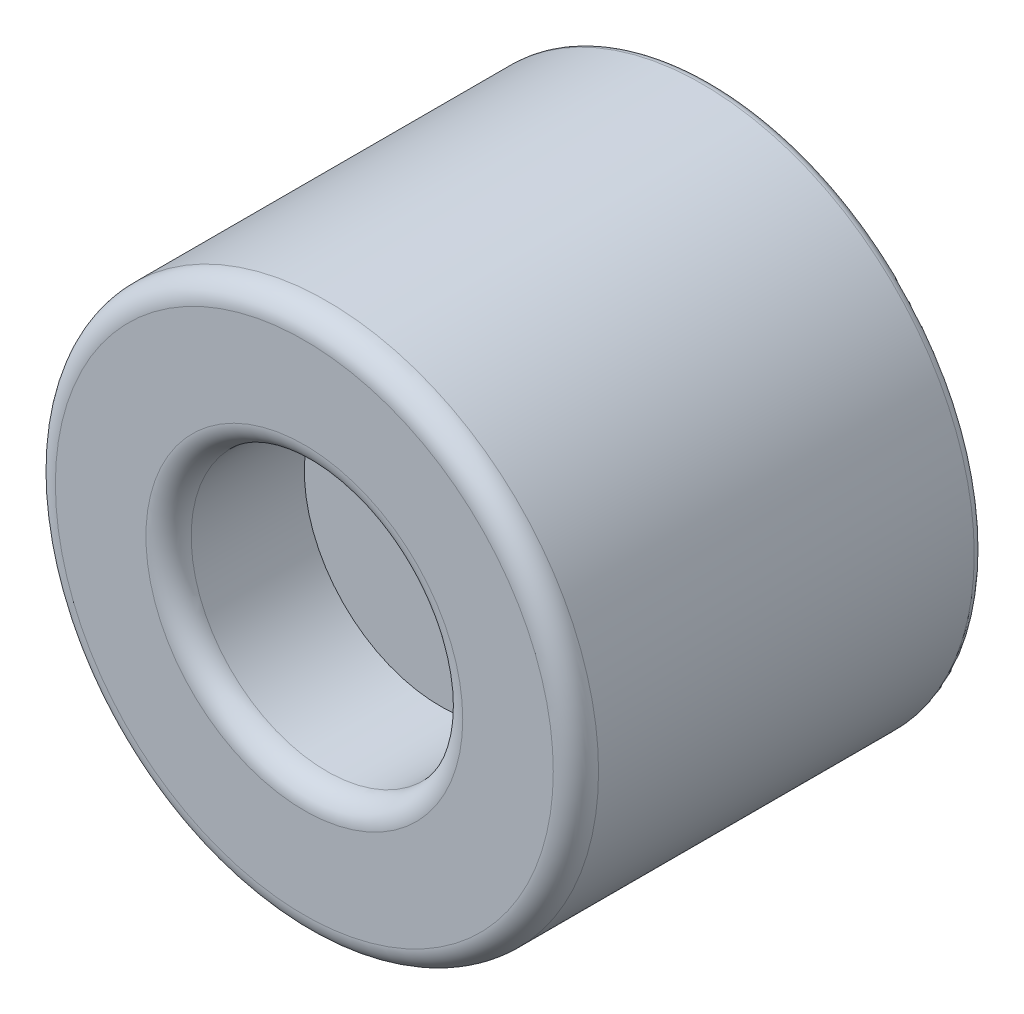
ISO-10303-21;
HEADER;
FILE_DESCRIPTION(('STEP AP214'),'2;1');
FILE_NAME('part.step','',(''),(''),'','','');
FILE_SCHEMA(('AUTOMOTIVE_DESIGN { 1 0 10303 214 1 1 1 1 }'));
ENDSEC;
DATA;
#1=APPLICATION_CONTEXT('core data for automotive mechanical design processes');
#2=APPLICATION_PROTOCOL_DEFINITION('international standard','automotive_design',2000,#1);
#3=PRODUCT_CONTEXT('',#1,'mechanical');
#4=PRODUCT('Part','Part','',(#3));
#5=PRODUCT_RELATED_PRODUCT_CATEGORY('part','',(#4));
#6=PRODUCT_DEFINITION_FORMATION('','',#4);
#7=PRODUCT_DEFINITION_CONTEXT('part definition',#1,'design');
#8=PRODUCT_DEFINITION('design','',#6,#7);
#9=PRODUCT_DEFINITION_SHAPE('','',#8);
#10=(LENGTH_UNIT() NAMED_UNIT(*) SI_UNIT(.MILLI.,.METRE.));
#11=(NAMED_UNIT(*) PLANE_ANGLE_UNIT() SI_UNIT($,.RADIAN.));
#12=(NAMED_UNIT(*) SI_UNIT($,.STERADIAN.) SOLID_ANGLE_UNIT());
#13=UNCERTAINTY_MEASURE_WITH_UNIT(LENGTH_MEASURE(1.E-05),#10,'distance_accuracy_value','');
#14=(GEOMETRIC_REPRESENTATION_CONTEXT(3) GLOBAL_UNCERTAINTY_ASSIGNED_CONTEXT((#13)) GLOBAL_UNIT_ASSIGNED_CONTEXT((#10,
#11,#12)) REPRESENTATION_CONTEXT('',''));
#15=CARTESIAN_POINT('',(0.,0.,0.));
#16=DIRECTION('',(0.,0.,1.));
#17=DIRECTION('',(1.,0.,0.));
#18=AXIS2_PLACEMENT_3D('',#15,#16,#17);
#19=CARTESIAN_POINT('',(0.,0.,0.));
#20=DIRECTION('',(0.,0.,1.));
#21=DIRECTION('',(1.,0.,0.));
#22=AXIS2_PLACEMENT_3D('',#19,#20,#21);
#23=PLANE('',#22);
#24=CARTESIAN_POINT('',(0.,0.,0.));
#25=DIRECTION('',(0.,0.,1.));
#26=DIRECTION('',(1.,0.,0.));
#27=AXIS2_PLACEMENT_3D('',#24,#25,#26);
#28=CIRCLE('',#27,5.8);
#29=CARTESIAN_POINT('',(5.8,0.,0.));
#30=VERTEX_POINT('',#29);
#31=EDGE_CURVE('E44',#30,#30,#28,.F.);
#32=ORIENTED_EDGE('',*,*,#31,.T.);
#33=EDGE_LOOP('',(#32));
#34=FACE_BOUND('',#33,.T.);
#35=CARTESIAN_POINT('',(0.,0.,0.));
#36=DIRECTION('',(0.,0.,1.));
#37=DIRECTION('',(1.,0.,0.));
#38=AXIS2_PLACEMENT_3D('',#35,#36,#37);
#39=CIRCLE('',#38,4.7);
#40=CARTESIAN_POINT('',(4.7,0.,0.));
#41=VERTEX_POINT('',#40);
#42=EDGE_CURVE('E48',#41,#41,#39,.T.);
#43=ORIENTED_EDGE('',*,*,#42,.T.);
#44=EDGE_LOOP('',(#43));
#45=FACE_BOUND('',#44,.T.);
#46=ADVANCED_FACE('F37',(#34,#45),#23,.F.);
#47=CARTESIAN_POINT('',(0.,0.,3.));
#48=DIRECTION('',(0.,0.,-1.));
#49=DIRECTION('',(-1.,0.,0.));
#50=AXIS2_PLACEMENT_3D('',#47,#48,#49);
#51=CYLINDRICAL_SURFACE('',#50,6.);
#52=CARTESIAN_POINT('',(0.,0.,0.2));
#53=DIRECTION('',(0.,0.,1.));
#54=DIRECTION('',(1.,0.,0.));
#55=AXIS2_PLACEMENT_3D('',#52,#53,#54);
#56=CIRCLE('',#55,6.);
#57=CARTESIAN_POINT('',(6.,0.,0.2));
#58=VERTEX_POINT('',#57);
#59=EDGE_CURVE('E52',#58,#58,#56,.T.);
#60=ORIENTED_EDGE('',*,*,#59,.T.);
#61=EDGE_LOOP('',(#60));
#62=FACE_BOUND('',#61,.T.);
#63=CARTESIAN_POINT('',(0.,0.,8.5));
#64=DIRECTION('',(0.,0.,1.));
#65=DIRECTION('',(1.,0.,0.));
#66=AXIS2_PLACEMENT_3D('',#63,#64,#65);
#67=CIRCLE('',#66,6.);
#68=CARTESIAN_POINT('',(6.,0.,8.5));
#69=VERTEX_POINT('',#68);
#70=EDGE_CURVE('E57',#69,#69,#67,.F.);
#71=ORIENTED_EDGE('',*,*,#70,.T.);
#72=EDGE_LOOP('',(#71));
#73=FACE_BOUND('',#72,.T.);
#74=ADVANCED_FACE('F93',(#62,#73),#51,.T.);
#75=CARTESIAN_POINT('',(0.,0.,3.));
#76=DIRECTION('',(0.,0.,-1.));
#77=DIRECTION('',(-1.,0.,0.));
#78=AXIS2_PLACEMENT_3D('',#75,#76,#77);
#79=CYLINDRICAL_SURFACE('',#78,4.5);
#80=CARTESIAN_POINT('',(0.,0.,0.2));
#81=DIRECTION('',(0.,0.,1.));
#82=DIRECTION('',(1.,0.,0.));
#83=AXIS2_PLACEMENT_3D('',#80,#81,#82);
#84=CIRCLE('',#83,4.5);
#85=CARTESIAN_POINT('',(4.5,0.,0.2));
#86=VERTEX_POINT('',#85);
#87=EDGE_CURVE('E10',#86,#86,#84,.F.);
#88=ORIENTED_EDGE('',*,*,#87,.T.);
#89=EDGE_LOOP('',(#88));
#90=FACE_BOUND('',#89,.T.);
#91=CARTESIAN_POINT('',(0.,0.,3.));
#92=DIRECTION('',(0.,0.,1.));
#93=DIRECTION('',(1.,0.,0.));
#94=AXIS2_PLACEMENT_3D('',#91,#92,#93);
#95=CIRCLE('',#94,4.5);
#96=CARTESIAN_POINT('',(4.5,0.,3.));
#97=VERTEX_POINT('',#96);
#98=EDGE_CURVE('E69',#97,#97,#95,.T.);
#99=ORIENTED_EDGE('',*,*,#98,.T.);
#100=EDGE_LOOP('',(#99));
#101=FACE_BOUND('',#100,.T.);
#102=ADVANCED_FACE('F98',(#90,#101),#79,.F.);
#103=CARTESIAN_POINT('',(0.,0.,3.));
#104=DIRECTION('',(0.,0.,1.));
#105=DIRECTION('',(1.,0.,0.));
#106=AXIS2_PLACEMENT_3D('',#103,#104,#105);
#107=PLANE('',#106);
#108=ORIENTED_EDGE('',*,*,#98,.F.);
#109=EDGE_LOOP('',(#108));
#110=FACE_BOUND('',#109,.T.);
#111=ADVANCED_FACE('F89',(#110),#107,.F.);
#112=CARTESIAN_POINT('',(0.,0.,9.));
#113=DIRECTION('',(0.,0.,1.));
#114=DIRECTION('',(1.,0.,0.));
#115=AXIS2_PLACEMENT_3D('',#112,#113,#114);
#116=PLANE('',#115);
#117=CARTESIAN_POINT('',(0.,0.,9.));
#118=DIRECTION('',(0.,0.,1.));
#119=DIRECTION('',(1.,0.,0.));
#120=AXIS2_PLACEMENT_3D('',#117,#118,#119);
#121=CIRCLE('',#120,5.5);
#122=CARTESIAN_POINT('',(5.5,0.,9.));
#123=VERTEX_POINT('',#122);
#124=EDGE_CURVE('E60',#123,#123,#121,.T.);
#125=ORIENTED_EDGE('',*,*,#124,.T.);
#126=EDGE_LOOP('',(#125));
#127=FACE_BOUND('',#126,.T.);
#128=CARTESIAN_POINT('',(0.,0.,9.));
#129=DIRECTION('',(0.,0.,1.));
#130=DIRECTION('',(1.,0.,0.));
#131=AXIS2_PLACEMENT_3D('',#128,#129,#130);
#132=CIRCLE('',#131,3.5);
#133=CARTESIAN_POINT('',(3.5,0.,9.));
#134=VERTEX_POINT('',#133);
#135=EDGE_CURVE('E63',#134,#134,#132,.F.);
#136=ORIENTED_EDGE('',*,*,#135,.T.);
#137=EDGE_LOOP('',(#136));
#138=FACE_BOUND('',#137,.T.);
#139=ADVANCED_FACE('F80',(#127,#138),#116,.T.);
#140=CARTESIAN_POINT('',(0.,0.,6.));
#141=DIRECTION('',(0.,0.,1.));
#142=DIRECTION('',(1.,0.,0.));
#143=AXIS2_PLACEMENT_3D('',#140,#141,#142);
#144=CYLINDRICAL_SURFACE('',#143,3.);
#145=CARTESIAN_POINT('',(0.,0.,8.5));
#146=DIRECTION('',(0.,0.,1.));
#147=DIRECTION('',(1.,0.,0.));
#148=AXIS2_PLACEMENT_3D('',#145,#146,#147);
#149=CIRCLE('',#148,3.);
#150=CARTESIAN_POINT('',(3.,0.,8.5));
#151=VERTEX_POINT('',#150);
#152=EDGE_CURVE('E66',#151,#151,#149,.T.);
#153=ORIENTED_EDGE('',*,*,#152,.T.);
#154=EDGE_LOOP('',(#153));
#155=FACE_BOUND('',#154,.T.);
#156=CARTESIAN_POINT('',(0.,0.,6.));
#157=DIRECTION('',(0.,0.,1.));
#158=DIRECTION('',(1.,0.,0.));
#159=AXIS2_PLACEMENT_3D('',#156,#157,#158);
#160=CIRCLE('',#159,3.);
#161=CARTESIAN_POINT('',(3.,0.,6.));
#162=VERTEX_POINT('',#161);
#163=EDGE_CURVE('E72',#162,#162,#160,.T.);
#164=ORIENTED_EDGE('',*,*,#163,.F.);
#165=EDGE_LOOP('',(#164));
#166=FACE_BOUND('',#165,.T.);
#167=ADVANCED_FACE('F78',(#155,#166),#144,.F.);
#168=CARTESIAN_POINT('',(0.,0.,6.));
#169=DIRECTION('',(0.,0.,1.));
#170=DIRECTION('',(1.,0.,0.));
#171=AXIS2_PLACEMENT_3D('',#168,#169,#170);
#172=PLANE('',#171);
#173=ORIENTED_EDGE('',*,*,#163,.T.);
#174=EDGE_LOOP('',(#173));
#175=FACE_BOUND('',#174,.T.);
#176=ADVANCED_FACE('F76',(#175),#172,.T.);
#177=CARTESIAN_POINT('',(0.,0.,8.5));
#178=DIRECTION('',(0.,0.,1.));
#179=DIRECTION('',(1.,0.,0.));
#180=AXIS2_PLACEMENT_3D('',#177,#178,#179);
#181=TOROIDAL_SURFACE('',#180,3.5,0.5);
#182=ORIENTED_EDGE('',*,*,#135,.F.);
#183=EDGE_LOOP('',(#182));
#184=FACE_BOUND('',#183,.T.);
#185=ORIENTED_EDGE('',*,*,#152,.F.);
#186=EDGE_LOOP('',(#185));
#187=FACE_BOUND('',#186,.T.);
#188=ADVANCED_FACE('F87',(#184,#187),#181,.T.);
#189=CARTESIAN_POINT('',(0.,0.,8.5));
#190=DIRECTION('',(0.,0.,1.));
#191=DIRECTION('',(1.,0.,0.));
#192=AXIS2_PLACEMENT_3D('',#189,#190,#191);
#193=TOROIDAL_SURFACE('',#192,5.5,0.5);
#194=ORIENTED_EDGE('',*,*,#70,.F.);
#195=EDGE_LOOP('',(#194));
#196=FACE_BOUND('',#195,.T.);
#197=ORIENTED_EDGE('',*,*,#124,.F.);
#198=EDGE_LOOP('',(#197));
#199=FACE_BOUND('',#198,.T.);
#200=ADVANCED_FACE('F107',(#196,#199),#193,.T.);
#201=CARTESIAN_POINT('',(0.,0.,0.2));
#202=DIRECTION('',(0.,0.,1.));
#203=DIRECTION('',(1.,0.,0.));
#204=AXIS2_PLACEMENT_3D('',#201,#202,#203);
#205=TOROIDAL_SURFACE('',#204,5.8,0.2);
#206=ORIENTED_EDGE('',*,*,#31,.F.);
#207=EDGE_LOOP('',(#206));
#208=FACE_BOUND('',#207,.T.);
#209=ORIENTED_EDGE('',*,*,#59,.F.);
#210=EDGE_LOOP('',(#209));
#211=FACE_BOUND('',#210,.T.);
#212=ADVANCED_FACE('F110',(#208,#211),#205,.T.);
#213=CARTESIAN_POINT('',(0.,0.,0.2));
#214=DIRECTION('',(0.,0.,1.));
#215=DIRECTION('',(1.,0.,0.));
#216=AXIS2_PLACEMENT_3D('',#213,#214,#215);
#217=TOROIDAL_SURFACE('',#216,4.7,0.2);
#218=ORIENTED_EDGE('',*,*,#87,.F.);
#219=EDGE_LOOP('',(#218));
#220=FACE_BOUND('',#219,.T.);
#221=ORIENTED_EDGE('',*,*,#42,.F.);
#222=EDGE_LOOP('',(#221));
#223=FACE_BOUND('',#222,.T.);
#224=ADVANCED_FACE('F39',(#220,#223),#217,.T.);
#225=CLOSED_SHELL('',(#46,#74,#102,#111,#139,#167,#176,#188,#200,#212,#224));
#226=MANIFOLD_SOLID_BREP('B2',#225);
#227=ADVANCED_BREP_SHAPE_REPRESENTATION('',(#18,#226),#14);
#228=SHAPE_DEFINITION_REPRESENTATION(#9,#227);
ENDSEC;
END-ISO-10303-21;
